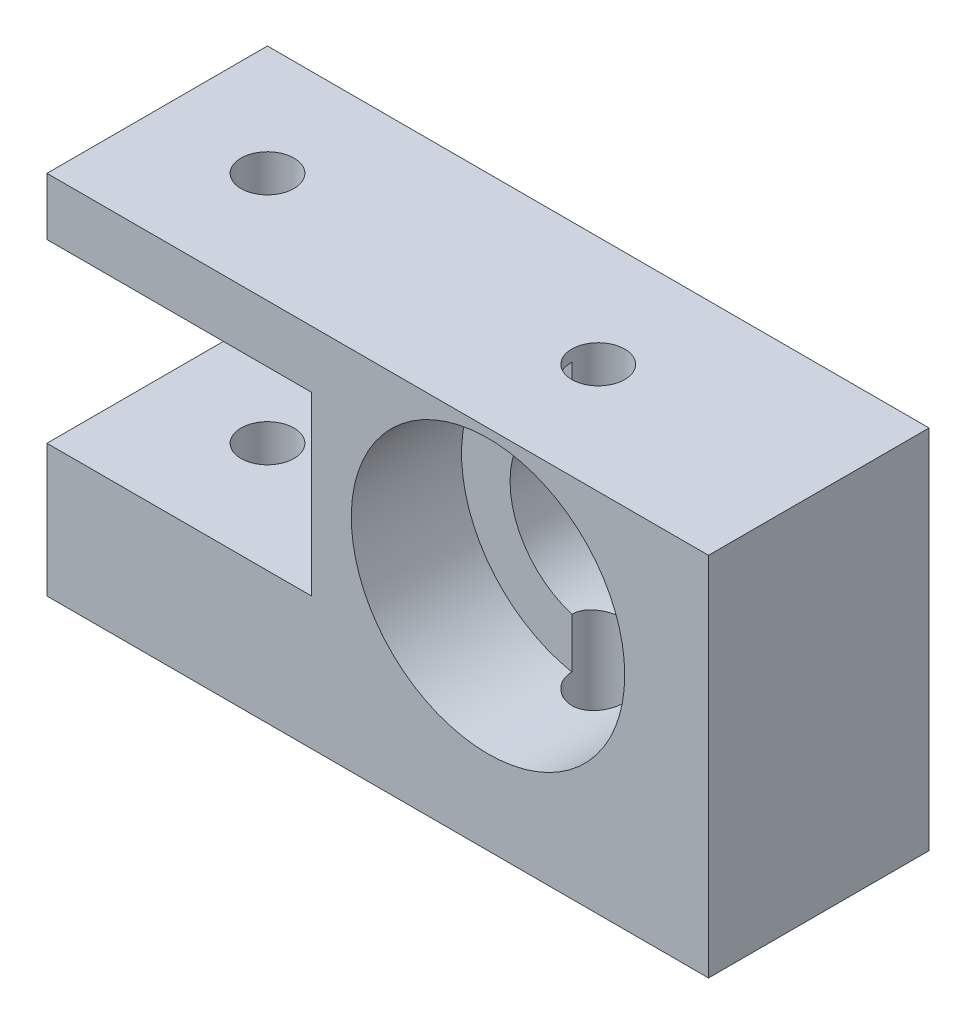
ISO-10303-21;
HEADER;
FILE_DESCRIPTION(('STEP AP214'),'2;1');
FILE_NAME('part.step','',(''),(''),'','','');
FILE_SCHEMA(('AUTOMOTIVE_DESIGN { 1 0 10303 214 1 1 1 1 }'));
ENDSEC;
DATA;
#1=APPLICATION_CONTEXT('core data for automotive mechanical design processes');
#2=APPLICATION_PROTOCOL_DEFINITION('international standard','automotive_design',2000,#1);
#3=PRODUCT_CONTEXT('',#1,'mechanical');
#4=PRODUCT('Part','Part','',(#3));
#5=PRODUCT_RELATED_PRODUCT_CATEGORY('part','',(#4));
#6=PRODUCT_DEFINITION_FORMATION('','',#4);
#7=PRODUCT_DEFINITION_CONTEXT('part definition',#1,'design');
#8=PRODUCT_DEFINITION('design','',#6,#7);
#9=PRODUCT_DEFINITION_SHAPE('','',#8);
#10=(LENGTH_UNIT() NAMED_UNIT(*) SI_UNIT(.MILLI.,.METRE.));
#11=(NAMED_UNIT(*) PLANE_ANGLE_UNIT() SI_UNIT($,.RADIAN.));
#12=(NAMED_UNIT(*) SI_UNIT($,.STERADIAN.) SOLID_ANGLE_UNIT());
#13=UNCERTAINTY_MEASURE_WITH_UNIT(LENGTH_MEASURE(1.E-05),#10,'distance_accuracy_value','');
#14=(GEOMETRIC_REPRESENTATION_CONTEXT(3) GLOBAL_UNCERTAINTY_ASSIGNED_CONTEXT((#13)) GLOBAL_UNIT_ASSIGNED_CONTEXT((#10,
#11,#12)) REPRESENTATION_CONTEXT('',''));
#15=CARTESIAN_POINT('',(0.,0.,0.));
#16=DIRECTION('',(0.,0.,1.));
#17=DIRECTION('',(1.,0.,0.));
#18=AXIS2_PLACEMENT_3D('',#15,#16,#17);
#19=CARTESIAN_POINT('',(0.,5.00000000000006,0.));
#20=DIRECTION('',(0.,-1.,0.));
#21=DIRECTION('',(1.,0.,0.));
#22=AXIS2_PLACEMENT_3D('',#19,#20,#21);
#23=CYLINDRICAL_SURFACE('',#22,0.6);
#24=CARTESIAN_POINT('',(0.,3.3,0.));
#25=DIRECTION('',(0.,-1.,0.));
#26=DIRECTION('',(1.,0.,0.));
#27=AXIS2_PLACEMENT_3D('',#24,#25,#26);
#28=CIRCLE('',#27,0.6);
#29=CARTESIAN_POINT('',(0.600000000000052,3.3,0.));
#30=VERTEX_POINT('',#29);
#31=EDGE_CURVE('E249',#30,#30,#28,.F.);
#32=ORIENTED_EDGE('',*,*,#31,.T.);
#33=EDGE_LOOP('',(#32));
#34=FACE_BOUND('',#33,.T.);
#35=DIRECTION('',(0.,-1.,0.));
#36=VECTOR('',#35,1.);
#37=CARTESIAN_POINT('',(-0.599999999999937,5.00000000000007,0.));
#38=LINE('',#37,#36);
#39=CARTESIAN_POINT('',(-0.599999999999957,1.9078784028339,0.));
#40=VERTEX_POINT('',#39);
#41=CARTESIAN_POINT('',(-0.59999999999995,3.04138126514912,0.));
#42=VERTEX_POINT('',#41);
#43=EDGE_CURVE('E176',#40,#42,#38,.F.);
#44=ORIENTED_EDGE('',*,*,#43,.F.);
#45=CARTESIAN_POINT('',(0.600000000000043,1.90787840283388,0.));
#46=CARTESIAN_POINT('',(0.599999590536835,1.90787874305864,0.0328778191669716));
#47=CARTESIAN_POINT('',(0.597288432676084,1.90873756141657,0.0657596896279538));
#48=CARTESIAN_POINT('',(0.586543377794207,1.91206631379487,0.130562099809387));
#49=CARTESIAN_POINT('',(0.578507702295427,1.91453678613028,0.162482314595133));
#50=CARTESIAN_POINT('',(0.557411013077367,1.92078440978677,0.224413891318323));
#51=CARTESIAN_POINT('',(0.544358357576347,1.92455938677114,0.254428331855816));
#52=CARTESIAN_POINT('',(0.51362568767243,1.93298773023204,0.311848773595534));
#53=CARTESIAN_POINT('',(0.495944980548436,1.93764122817541,0.339254383473071));
#54=CARTESIAN_POINT('',(0.455859016566365,1.94746744873138,0.391546556231669));
#55=CARTESIAN_POINT('',(0.433332828703221,1.9526512332434,0.416338359178706));
#56=CARTESIAN_POINT('',(0.384454495031934,1.96285944775015,0.461855180528808));
#57=CARTESIAN_POINT('',(0.358101858184503,1.96788385719166,0.482579676179897));
#58=CARTESIAN_POINT('',(0.301644575117507,1.97733285831668,0.519785079933374));
#59=CARTESIAN_POINT('',(0.271473608534367,1.98174289736938,0.536169369777136));
#60=CARTESIAN_POINT('',(0.20864985814779,1.98933774368296,0.563594903617086));
#61=CARTESIAN_POINT('',(0.175997611355211,1.99252281515804,0.574637299942974));
#62=CARTESIAN_POINT('',(0.110129541052376,1.9972305840143,0.590752000436205));
#63=CARTESIAN_POINT('',(0.0769565595815649,1.99879822947734,0.59598605106108));
#64=CARTESIAN_POINT('',(0.0101687294997707,2.00025280600541,0.600846929858574));
#65=CARTESIAN_POINT('',(-0.0234460248201029,2.00014009008432,0.600474935760784));
#66=CARTESIAN_POINT('',(-0.08902846264002,1.99827841527064,0.59424285258279));
#67=CARTESIAN_POINT('',(-0.121014507056493,1.99658168082106,0.588557922476051));
#68=CARTESIAN_POINT('',(-0.183555685376967,1.99180608845036,0.572147465602283));
#69=CARTESIAN_POINT('',(-0.214110728529095,1.9887271430023,0.561421619622931));
#70=CARTESIAN_POINT('',(-0.273338930540469,1.98146088394791,0.535115190632575));
#71=CARTESIAN_POINT('',(-0.301986025877748,1.97726107870702,0.51947951887709));
#72=CARTESIAN_POINT('',(-0.356305869513218,1.9681985625921,0.483840859028709));
#73=CARTESIAN_POINT('',(-0.381977909948808,1.96333569455042,0.463836834814612));
#74=CARTESIAN_POINT('',(-0.430664192611877,1.9532462019534,0.419120899699353));
#75=CARTESIAN_POINT('',(-0.453537832160406,1.94801278128862,0.394257232388077));
#76=CARTESIAN_POINT('',(-0.494830606159247,1.93793591954723,0.340995992844005));
#77=CARTESIAN_POINT('',(-0.513249297931353,1.93309251725774,0.312598069844407));
#78=CARTESIAN_POINT('',(-0.545255981341771,1.92431161280117,0.252704212300303));
#79=CARTESIAN_POINT('',(-0.558795956950726,1.92038324282302,0.221181181654453));
#80=CARTESIAN_POINT('',(-0.580333451513558,1.91398557015459,0.15615711662216));
#81=CARTESIAN_POINT('',(-0.588332778562004,1.91151579151712,0.122656731387589));
#82=CARTESIAN_POINT('',(-0.598299081128147,1.90841939830595,0.0559670557073196));
#83=CARTESIAN_POINT('',(-0.600479785520901,1.90772751519821,0.0228127104463217));
#84=CARTESIAN_POINT('',(-0.599343788932265,1.90808477028172,-0.0433891600023366));
#85=CARTESIAN_POINT('',(-0.596027857484727,1.9091336647626,-0.0764366994939145));
#86=CARTESIAN_POINT('',(-0.584183054296474,1.91279023408721,-0.140595351191037));
#87=CARTESIAN_POINT('',(-0.575791845725012,1.91535670599444,-0.171734465706131));
#88=CARTESIAN_POINT('',(-0.554194310991782,1.92171656496045,-0.232160676325247));
#89=CARTESIAN_POINT('',(-0.540987241371012,1.92551014144594,-0.261447485656034));
#90=CARTESIAN_POINT('',(-0.50972748478594,1.9340233400823,-0.318206985629055));
#91=CARTESIAN_POINT('',(-0.491554256690867,1.93876508427655,-0.345609888394372));
#92=CARTESIAN_POINT('',(-0.451021206401499,1.94859282259061,-0.39705524247227));
#93=CARTESIAN_POINT('',(-0.428660382139543,1.95367889892075,-0.421096887045103));
#94=CARTESIAN_POINT('',(-0.379382052997394,1.96385453419189,-0.466072162325912));
#95=CARTESIAN_POINT('',(-0.352324426342929,1.96893698025182,-0.486854251594799));
#96=CARTESIAN_POINT('',(-0.294984713836055,1.97833940699481,-0.523586680411099));
#97=CARTESIAN_POINT('',(-0.264702788217533,1.98265942553893,-0.539537259912585));
#98=CARTESIAN_POINT('',(-0.201974201882044,1.99002388189978,-0.566000012227321));
#99=CARTESIAN_POINT('',(-0.169545848815091,1.99307781369985,-0.576552806463592));
#100=CARTESIAN_POINT('',(-0.103267986601791,1.99760791838732,-0.59202436755617));
#101=CARTESIAN_POINT('',(-0.0694188869418608,1.99908454268352,-0.596944746379368));
#102=CARTESIAN_POINT('',(-0.00266086155305317,2.00026617632559,-0.600889217621801));
#103=CARTESIAN_POINT('',(0.0302340716345264,2.00003722044529,-0.600133078163134));
#104=CARTESIAN_POINT('',(0.095407792465805,1.99798905786014,-0.593271347000353));
#105=CARTESIAN_POINT('',(0.127686614938655,1.99616994132184,-0.587166058607824));
#106=CARTESIAN_POINT('',(0.190374325216587,1.99116467343331,-0.569915335440152));
#107=CARTESIAN_POINT('',(0.2207995709406,1.98799341160347,-0.558824727740397));
#108=CARTESIAN_POINT('',(0.279373295100864,1.98061177215778,-0.531967234197125));
#109=CARTESIAN_POINT('',(0.307521398420274,1.97640122379972,-0.516199579885524));
#110=CARTESIAN_POINT('',(0.361720756968269,1.96721586331296,-0.479850617027989));
#111=CARTESIAN_POINT('',(0.387676100030753,1.96222090769445,-0.459131427999702));
#112=CARTESIAN_POINT('',(0.435815028538419,1.9520941488491,-0.413715844666874));
#113=CARTESIAN_POINT('',(0.457997523840808,1.94696230656348,-0.389018304840712));
#114=CARTESIAN_POINT('',(0.498625077578248,1.93696272252611,-0.335463688675828));
#115=CARTESIAN_POINT('',(0.516939039031906,1.93210741077714,-0.306504578643938));
#116=CARTESIAN_POINT('',(0.548417254115109,1.92341019003195,-0.245777930335482));
#117=CARTESIAN_POINT('',(0.561583982229059,1.91956779437582,-0.214011750559107));
#118=CARTESIAN_POINT('',(0.581207770131964,1.91371126688106,-0.152103827357862));
#119=CARTESIAN_POINT('',(0.588235436045406,1.91154461939998,-0.122156541228919));
#120=CARTESIAN_POINT('',(0.597631275340182,1.90862817035074,-0.0614739110003776));
#121=CARTESIAN_POINT('',(0.600000382822801,1.90787808474478,-0.0307387261370159));
#122=CARTESIAN_POINT('',(0.600000000000043,1.90787840283388,0.));
#123=B_SPLINE_CURVE_WITH_KNOTS('',3,(#45,#46,#47,#48,#49,#50,#51,#52,#53,#54,#55,#56,#57,#58,
#59,#60,#61,#62,#63,#64,#65,#66,#67,#68,#69,#70,#71,#72,#73,#74,#75,#76,#77,#78,#79,#80,#81,#82,
#83,#84,#85,#86,#87,#88,#89,#90,#91,#92,#93,#94,#95,#96,#97,#98,#99,#100,#101,#102,#103,#104,
#105,#106,#107,#108,#109,#110,#111,#112,#113,#114,#115,#116,#117,#118,#119,#120,#121,#122),
.UNSPECIFIED.,.T.,.F.,(4,2,2,2,2,2,2,2,2,2,2,2,2,2,2,2,2,2,2,2,2,2,2,2,2,2,2,2,2,2,2,2,2,2,2,2,
2,2,4),(0.,0.0985200663519467,0.197073056647981,0.295462565758858,0.393866810120421,
0.495092600004316,0.596331391457472,0.699663757066959,0.802973822323889,0.903328560570612,
1.00366221637814,1.1008005039359,1.19794494353389,1.29622083731509,1.3945200663357,
1.49660858806549,1.59870724993983,1.70178495295745,1.80482900248603,1.9040323231203,
2.00322175637538,2.0998343797011,2.19646192412898,2.29568292718339,2.39492770366153,
2.49791802434824,2.60090322924264,2.70310156720313,2.80527064923256,2.90350521559071,
3.00173421213685,3.09890838743471,3.19609853791135,3.29639850816379,3.39672741046539,
3.50004655862242,3.60331597580161,3.69544461537562,3.78755478008007),.UNSPECIFIED.);
#124=CARTESIAN_POINT('',(0.600000000000043,1.90787840283388,0.));
#125=VERTEX_POINT('',#124);
#126=EDGE_CURVE('E11',#40,#125,#123,.T.);
#127=ORIENTED_EDGE('',*,*,#126,.T.);
#128=DIRECTION('',(0.,-1.,0.));
#129=VECTOR('',#128,1.);
#130=CARTESIAN_POINT('',(0.600000000000063,5.00000000000006,0.));
#131=LINE('',#130,#129);
#132=CARTESIAN_POINT('',(0.60000000000005,3.0413812651491,0.));
#133=VERTEX_POINT('',#132);
#134=EDGE_CURVE('E181',#133,#125,#131,.T.);
#135=ORIENTED_EDGE('',*,*,#134,.F.);
#136=CARTESIAN_POINT('',(0.60000000000005,3.0413812651491,0.));
#137=CARTESIAN_POINT('',(0.60003014107028,3.04135962845536,0.0334194408038753));
#138=CARTESIAN_POINT('',(0.597209826353904,3.04193152121581,0.0668230801908513));
#139=CARTESIAN_POINT('',(0.586099444078463,3.04409995212986,0.132624163564484));
#140=CARTESIAN_POINT('',(0.577817657800346,3.04569493885655,0.165023053307644));
#141=CARTESIAN_POINT('',(0.556012771140522,3.04974832281781,0.227950939705535));
#142=CARTESIAN_POINT('',(0.542488972692526,3.05220683504194,0.258479686690512));
#143=CARTESIAN_POINT('',(0.510605322385548,3.05770252810659,0.316839707769189));
#144=CARTESIAN_POINT('',(0.492245059987178,3.06073975806505,0.344670752596115));
#145=CARTESIAN_POINT('',(0.450951200562389,3.06709679592976,0.397205901572623));
#146=CARTESIAN_POINT('',(0.427966357393875,3.07041950705926,0.421869381278697));
#147=CARTESIAN_POINT('',(0.37818469740508,3.07694744770666,0.467017831407349));
#148=CARTESIAN_POINT('',(0.351387292569414,3.08015265900635,0.487502156086075));
#149=CARTESIAN_POINT('',(0.294472427163447,3.08611568209301,0.523865874892667));
#150=CARTESIAN_POINT('',(0.264329763185039,3.08886964768389,0.539706506804978));
#151=CARTESIAN_POINT('',(0.201750341178271,3.09358693017056,0.566082503992346));
#152=CARTESIAN_POINT('',(0.169313910738606,3.09555035970125,0.576618625103251));
#153=CARTESIAN_POINT('',(0.103491169941702,3.09844492336338,0.591960668025206));
#154=CARTESIAN_POINT('',(0.0701215315258731,3.09938850330172,0.596835730930017));
#155=CARTESIAN_POINT('',(0.00302476599431574,3.10017999936263,0.600932869086223));
#156=CARTESIAN_POINT('',(-0.0307023369517901,3.1000279890965,0.600155324129076));
#157=CARTESIAN_POINT('',(-0.0970803456066664,3.09865507806165,0.593021855372236));
#158=CARTESIAN_POINT('',(-0.129739607457678,3.09744847308192,0.586740536335284));
#159=CARTESIAN_POINT('',(-0.193531392516181,3.09411803796599,0.568896024433195));
#160=CARTESIAN_POINT('',(-0.224663868269231,3.09199417934049,0.557332667510712));
#161=CARTESIAN_POINT('',(-0.284733773810673,3.08704410230084,0.529181981558555));
#162=CARTESIAN_POINT('',(-0.313656968187265,3.08421376085188,0.512565030817269));
#163=CARTESIAN_POINT('',(-0.368331208252142,3.07816338826119,0.474801227076458));
#164=CARTESIAN_POINT('',(-0.394082016229092,3.07494332795308,0.453654034944413));
#165=CARTESIAN_POINT('',(-0.442120951624487,3.06840793858233,0.407022957764069));
#166=CARTESIAN_POINT('',(-0.464346155116491,3.06509191138792,0.38147430829603));
#167=CARTESIAN_POINT('',(-0.504212201602446,3.05878714607584,0.326970968017063));
#168=CARTESIAN_POINT('',(-0.52185176851951,3.05579849919414,0.298015332369755));
#169=CARTESIAN_POINT('',(-0.552066007993741,3.05048520003543,0.237428987383769));
#170=CARTESIAN_POINT('',(-0.564628115543932,3.04816219908932,0.205791873270527));
#171=CARTESIAN_POINT('',(-0.584223098571664,3.04446784907679,0.140821595906898));
#172=CARTESIAN_POINT('',(-0.591264214548973,3.04309508207432,0.107491039733943));
#173=CARTESIAN_POINT('',(-0.596959985771136,3.04197963542445,0.0615805025097326));
#174=CARTESIAN_POINT('',(-0.59810040330446,3.04175548339478,0.0492823217500671));
#175=CARTESIAN_POINT('',(-0.599619447428007,3.04145642824819,0.0246579311037416));
#176=CARTESIAN_POINT('',(-0.599999351125864,3.04138127492434,0.0123318030637616));
#177=CARTESIAN_POINT('',(-0.599999999999952,3.04138126514914,0.));
#178=B_SPLINE_CURVE_WITH_KNOTS('',3,(#136,#137,#138,#139,#140,#141,#142,#143,#144,#145,#146,
#147,#148,#149,#150,#151,#152,#153,#154,#155,#156,#157,#158,#159,#160,#161,#162,#163,#164,#165,
#166,#167,#168,#169,#170,#171,#172,#173,#174,#175,#176,#177),.UNSPECIFIED.,.F.,.F.,(4,2,2,2,2,2,
2,2,2,2,2,2,2,2,2,2,2,2,2,2,4),(0.,0.100110729627641,0.200070008374164,0.300042603035742,
0.400023686527437,0.50118061774217,0.602353167443441,0.704347638986313,0.806327573295771,
0.907048425901526,1.00776251126519,1.10713215659886,1.20650488851186,1.3064717039744,
1.40644600553963,1.50804152993869,1.60966529583845,1.71153902896512,1.8132604168134,
1.85030068262917,1.88727869550581),.UNSPECIFIED.);
#179=EDGE_CURVE('E253',#133,#42,#178,.T.);
#180=ORIENTED_EDGE('',*,*,#179,.T.);
#181=EDGE_LOOP('',(#44,#127,#135,#180));
#182=FACE_BOUND('',#181,.T.);
#183=ADVANCED_FACE('F43',(#34,#182),#23,.F.);
#184=CARTESIAN_POINT('',(-10.,0.,2.5));
#185=DIRECTION('',(-1.,0.,0.));
#186=DIRECTION('',(0.,0.,1.));
#187=AXIS2_PLACEMENT_3D('',#184,#185,#186);
#188=PLANE('',#187);
#189=DIRECTION('',(0.,0.,-1.));
#190=VECTOR('',#189,1.);
#191=CARTESIAN_POINT('',(-10.,-2.,2.5));
#192=LINE('',#191,#190);
#193=CARTESIAN_POINT('',(-10.,-2.,2.5));
#194=VERTEX_POINT('',#193);
#195=CARTESIAN_POINT('',(-10.,-2.,-2.5));
#196=VERTEX_POINT('',#195);
#197=EDGE_CURVE('E188',#194,#196,#192,.T.);
#198=ORIENTED_EDGE('',*,*,#197,.T.);
#199=DIRECTION('',(0.,1.,0.));
#200=VECTOR('',#199,1.);
#201=CARTESIAN_POINT('',(-10.,-5.,-2.5));
#202=LINE('',#201,#200);
#203=CARTESIAN_POINT('',(-10.,-5.,-2.5));
#204=VERTEX_POINT('',#203);
#205=EDGE_CURVE('E157',#204,#196,#202,.T.);
#206=ORIENTED_EDGE('',*,*,#205,.F.);
#207=DIRECTION('',(0.,0.,-1.));
#208=VECTOR('',#207,1.);
#209=CARTESIAN_POINT('',(-10.,-5.,2.5));
#210=LINE('',#209,#208);
#211=CARTESIAN_POINT('',(-10.,-5.,2.5));
#212=VERTEX_POINT('',#211);
#213=EDGE_CURVE('E154',#212,#204,#210,.T.);
#214=ORIENTED_EDGE('',*,*,#213,.F.);
#215=DIRECTION('',(0.,1.,0.));
#216=VECTOR('',#215,1.);
#217=CARTESIAN_POINT('',(-10.,0.,2.5));
#218=LINE('',#217,#216);
#219=EDGE_CURVE('E172',#212,#194,#218,.T.);
#220=ORIENTED_EDGE('',*,*,#219,.T.);
#221=EDGE_LOOP('',(#198,#206,#214,#220));
#222=FACE_BOUND('',#221,.T.);
#223=ADVANCED_FACE('F236',(#222),#188,.T.);
#224=CARTESIAN_POINT('',(-7.49999999999992,5.00000000000011,0.));
#225=DIRECTION('',(0.,-1.,0.));
#226=DIRECTION('',(1.,0.,0.));
#227=AXIS2_PLACEMENT_3D('',#224,#225,#226);
#228=CYLINDRICAL_SURFACE('',#227,0.6);
#229=CARTESIAN_POINT('',(-7.49999999999997,-2.,0.));
#230=DIRECTION('',(0.,-1.,0.));
#231=DIRECTION('',(1.,0.,0.));
#232=AXIS2_PLACEMENT_3D('',#229,#230,#231);
#233=CIRCLE('',#232,0.6);
#234=CARTESIAN_POINT('',(-6.89999999999997,-2.,0.));
#235=VERTEX_POINT('',#234);
#236=EDGE_CURVE('E187',#235,#235,#233,.F.);
#237=ORIENTED_EDGE('',*,*,#236,.T.);
#238=EDGE_LOOP('',(#237));
#239=FACE_BOUND('',#238,.T.);
#240=CARTESIAN_POINT('',(-7.49999999999999,-4.99999999999995,0.));
#241=DIRECTION('',(0.,-1.,0.));
#242=DIRECTION('',(1.,0.,0.));
#243=AXIS2_PLACEMENT_3D('',#240,#241,#242);
#244=CIRCLE('',#243,0.6);
#245=CARTESIAN_POINT('',(-6.89999999999999,-4.99999999999996,0.));
#246=VERTEX_POINT('',#245);
#247=EDGE_CURVE('E292',#246,#246,#244,.T.);
#248=ORIENTED_EDGE('',*,*,#247,.T.);
#249=EDGE_LOOP('',(#248));
#250=FACE_BOUND('',#249,.T.);
#251=ADVANCED_FACE('F227',(#239,#250),#228,.F.);
#252=CARTESIAN_POINT('',(0.,0.,0.));
#253=DIRECTION('',(0.,0.,-1.));
#254=DIRECTION('',(-1.,0.,0.));
#255=AXIS2_PLACEMENT_3D('',#252,#253,#254);
#256=PLANE('',#255);
#257=ORIENTED_EDGE('',*,*,#134,.T.);
#258=CARTESIAN_POINT('',(0.,0.,0.));
#259=DIRECTION('',(0.,0.,-1.));
#260=DIRECTION('',(-1.,0.,0.));
#261=AXIS2_PLACEMENT_3D('',#258,#259,#260);
#262=CIRCLE('',#261,2.);
#263=CARTESIAN_POINT('',(0.600000000000018,-1.90787840283389,0.));
#264=VERTEX_POINT('',#263);
#265=EDGE_CURVE('E258',#125,#264,#262,.T.);
#266=ORIENTED_EDGE('',*,*,#265,.T.);
#267=CARTESIAN_POINT('',(0.600000000000011,-3.04138126514911,0.));
#268=VERTEX_POINT('',#267);
#269=EDGE_CURVE('E180',#264,#268,#131,.T.);
#270=ORIENTED_EDGE('',*,*,#269,.T.);
#271=CARTESIAN_POINT('',(0.,0.,0.));
#272=DIRECTION('',(0.,0.,1.));
#273=DIRECTION('',(1.,0.,0.));
#274=AXIS2_PLACEMENT_3D('',#271,#272,#273);
#275=CIRCLE('',#274,3.1);
#276=EDGE_CURVE('E156',#268,#133,#275,.T.);
#277=ORIENTED_EDGE('',*,*,#276,.T.);
#278=EDGE_LOOP('',(#257,#266,#270,#277));
#279=FACE_BOUND('',#278,.T.);
#280=ADVANCED_FACE('F235',(#279),#256,.F.);
#281=CARTESIAN_POINT('',(0.,-5.,2.5));
#282=DIRECTION('',(0.,1.,0.));
#283=DIRECTION('',(0.,0.,1.));
#284=AXIS2_PLACEMENT_3D('',#281,#282,#283);
#285=PLANE('',#284);
#286=ORIENTED_EDGE('',*,*,#247,.F.);
#287=EDGE_LOOP('',(#286));
#288=FACE_BOUND('',#287,.T.);
#289=CARTESIAN_POINT('',(0.,-5.,0.));
#290=DIRECTION('',(0.,-1.,0.));
#291=DIRECTION('',(1.,0.,0.));
#292=AXIS2_PLACEMENT_3D('',#289,#290,#291);
#293=CIRCLE('',#292,0.6);
#294=CARTESIAN_POINT('',(0.599999999999998,-5.,0.));
#295=VERTEX_POINT('',#294);
#296=EDGE_CURVE('E191',#295,#295,#293,.T.);
#297=ORIENTED_EDGE('',*,*,#296,.F.);
#298=EDGE_LOOP('',(#297));
#299=FACE_BOUND('',#298,.T.);
#300=DIRECTION('',(-1.,0.,0.));
#301=VECTOR('',#300,1.);
#302=CARTESIAN_POINT('',(-10.,-5.,-2.5));
#303=LINE('',#302,#301);
#304=CARTESIAN_POINT('',(5.,-5.,-2.5));
#305=VERTEX_POINT('',#304);
#306=EDGE_CURVE('E148',#305,#204,#303,.T.);
#307=ORIENTED_EDGE('',*,*,#306,.F.);
#308=DIRECTION('',(0.,0.,1.));
#309=VECTOR('',#308,1.);
#310=CARTESIAN_POINT('',(5.,-5.,-2.5));
#311=LINE('',#310,#309);
#312=CARTESIAN_POINT('',(5.,-5.,2.5));
#313=VERTEX_POINT('',#312);
#314=EDGE_CURVE('E132',#305,#313,#311,.T.);
#315=ORIENTED_EDGE('',*,*,#314,.T.);
#316=DIRECTION('',(1.,0.,0.));
#317=VECTOR('',#316,1.);
#318=CARTESIAN_POINT('',(0.,-5.,2.5));
#319=LINE('',#318,#317);
#320=EDGE_CURVE('E169',#212,#313,#319,.T.);
#321=ORIENTED_EDGE('',*,*,#320,.F.);
#322=ORIENTED_EDGE('',*,*,#213,.T.);
#323=EDGE_LOOP('',(#307,#315,#321,#322));
#324=FACE_BOUND('',#323,.T.);
#325=ADVANCED_FACE('F153',(#288,#299,#324),#285,.F.);
#326=CARTESIAN_POINT('',(0.,0.,2.5));
#327=DIRECTION('',(0.,0.,-1.));
#328=DIRECTION('',(-1.,0.,0.));
#329=AXIS2_PLACEMENT_3D('',#326,#327,#328);
#330=CYLINDRICAL_SURFACE('',#329,3.1);
#331=CARTESIAN_POINT('',(-0.599999999999989,-3.04138126514911,0.));
#332=CARTESIAN_POINT('',(-0.600030141070219,-3.04135962845537,0.0334194408038754));
#333=CARTESIAN_POINT('',(-0.597209826353842,-3.04193152121583,0.0668230801908514));
#334=CARTESIAN_POINT('',(-0.586099444078401,-3.04409995212987,0.132624163564484));
#335=CARTESIAN_POINT('',(-0.577817657800284,-3.04569493885656,0.165023053307644));
#336=CARTESIAN_POINT('',(-0.55601277114046,-3.04974832281783,0.227950939705536));
#337=CARTESIAN_POINT('',(-0.542488972692464,-3.05220683504195,0.258479686690512));
#338=CARTESIAN_POINT('',(-0.510605322385487,-3.0577025281066,0.316839707769189));
#339=CARTESIAN_POINT('',(-0.492245059987116,-3.06073975806507,0.344670752596116));
#340=CARTESIAN_POINT('',(-0.450951200562327,-3.06709679592977,0.397205901572623));
#341=CARTESIAN_POINT('',(-0.427966357393813,-3.07041950705927,0.421869381278698));
#342=CARTESIAN_POINT('',(-0.378184697405018,-3.07694744770667,0.467017831407349));
#343=CARTESIAN_POINT('',(-0.351387292569352,-3.08015265900636,0.487502156086076));
#344=CARTESIAN_POINT('',(-0.294472427163384,-3.08611568209302,0.523865874892668));
#345=CARTESIAN_POINT('',(-0.264329763184977,-3.0888696476839,0.539706506804979));
#346=CARTESIAN_POINT('',(-0.201750341178209,-3.09358693017057,0.566082503992347));
#347=CARTESIAN_POINT('',(-0.169313910738544,-3.09555035970126,0.576618625103251));
#348=CARTESIAN_POINT('',(-0.103491169941639,-3.09844492336338,0.591960668025206));
#349=CARTESIAN_POINT('',(-0.0701215315258106,-3.09938850330173,0.596835730930017));
#350=CARTESIAN_POINT('',(-0.00302476599425337,-3.10017999936264,0.600932869086223));
#351=CARTESIAN_POINT('',(0.0307023369518524,-3.1000279890965,0.600155324129076));
#352=CARTESIAN_POINT('',(0.0970803456067285,-3.09865507806165,0.593021855372236));
#353=CARTESIAN_POINT('',(0.12973960745774,-3.09744847308192,0.586740536335284));
#354=CARTESIAN_POINT('',(0.193531392516243,-3.09411803796599,0.568896024433195));
#355=CARTESIAN_POINT('',(0.224663868269292,-3.09199417934048,0.557332667510712));
#356=CARTESIAN_POINT('',(0.284733773810735,-3.08704410230084,0.529181981558555));
#357=CARTESIAN_POINT('',(0.313656968187326,-3.08421376085187,0.512565030817269));
#358=CARTESIAN_POINT('',(0.368331208252204,-3.07816338826118,0.474801227076457));
#359=CARTESIAN_POINT('',(0.394082016229154,-3.07494332795308,0.453654034944413));
#360=CARTESIAN_POINT('',(0.442120951624549,-3.06840793858233,0.407022957764069));
#361=CARTESIAN_POINT('',(0.464346155116552,-3.06509191138791,0.381474308296029));
#362=CARTESIAN_POINT('',(0.504212201602508,-3.05878714607583,0.326970968017063));
#363=CARTESIAN_POINT('',(0.521851768519572,-3.05579849919414,0.298015332369754));
#364=CARTESIAN_POINT('',(0.552066007993803,-3.05048520003542,0.237428987383767));
#365=CARTESIAN_POINT('',(0.564628115543994,-3.04816219908931,0.205791873270525));
#366=CARTESIAN_POINT('',(0.584223098571726,-3.04446784907679,0.140821595906897));
#367=CARTESIAN_POINT('',(0.591264214549035,-3.04309508207431,0.107491039733942));
#368=CARTESIAN_POINT('',(0.596959985771198,-3.04197963542444,0.0615805025097313));
#369=CARTESIAN_POINT('',(0.598100403304521,-3.04175548339477,0.0492823217500661));
#370=CARTESIAN_POINT('',(0.599619447428068,-3.04145642824818,0.0246579311037411));
#371=CARTESIAN_POINT('',(0.599999351125926,-3.04138127492433,0.0123318030637614));
#372=CARTESIAN_POINT('',(0.600000000000013,-3.04138126514913,0.));
#373=B_SPLINE_CURVE_WITH_KNOTS('',3,(#331,#332,#333,#334,#335,#336,#337,#338,#339,#340,#341,
#342,#343,#344,#345,#346,#347,#348,#349,#350,#351,#352,#353,#354,#355,#356,#357,#358,#359,#360,
#361,#362,#363,#364,#365,#366,#367,#368,#369,#370,#371,#372),.UNSPECIFIED.,.F.,.F.,(4,2,2,2,2,2,
2,2,2,2,2,2,2,2,2,2,2,2,2,2,4),(0.,0.100110729627641,0.200070008374164,0.300042603035742,
0.400023686527438,0.50118061774217,0.602353167443442,0.704347638986314,0.806327573295772,
0.907048425901526,1.00776251126519,1.10713215659886,1.20650488851186,1.3064717039744,
1.40644600553963,1.5080415299387,1.60966529583845,1.71153902896513,1.81326041681341,
1.85030068262917,1.88727869550581),.UNSPECIFIED.);
#374=CARTESIAN_POINT('',(-0.599999999999989,-3.04138126514911,0.));
#375=VERTEX_POINT('',#374);
#376=EDGE_CURVE('E301',#375,#268,#373,.T.);
#377=ORIENTED_EDGE('',*,*,#376,.F.);
#378=EDGE_CURVE('E160',#42,#375,#275,.T.);
#379=ORIENTED_EDGE('',*,*,#378,.F.);
#380=ORIENTED_EDGE('',*,*,#179,.F.);
#381=ORIENTED_EDGE('',*,*,#276,.F.);
#382=EDGE_LOOP('',(#377,#379,#380,#381));
#383=FACE_BOUND('',#382,.T.);
#384=CARTESIAN_POINT('',(0.,0.,2.5));
#385=DIRECTION('',(0.,0.,1.));
#386=DIRECTION('',(1.,0.,0.));
#387=AXIS2_PLACEMENT_3D('',#384,#385,#386);
#388=CIRCLE('',#387,3.1);
#389=CARTESIAN_POINT('',(3.1,0.,2.5));
#390=VERTEX_POINT('',#389);
#391=EDGE_CURVE('E166',#390,#390,#388,.T.);
#392=ORIENTED_EDGE('',*,*,#391,.T.);
#393=EDGE_LOOP('',(#392));
#394=FACE_BOUND('',#393,.T.);
#395=ADVANCED_FACE('F45',(#383,#394),#330,.F.);
#396=DIRECTION('',(0.,0.,1.));
#397=VECTOR('',#396,1.);
#398=CARTESIAN_POINT('',(-10.,3.3,-2.5));
#399=LINE('',#398,#397);
#400=CARTESIAN_POINT('',(-10.,3.3,-2.5));
#401=VERTEX_POINT('',#400);
#402=CARTESIAN_POINT('',(-10.,3.3,2.5));
#403=VERTEX_POINT('',#402);
#404=EDGE_CURVE('E319',#401,#403,#399,.T.);
#405=ORIENTED_EDGE('',*,*,#404,.F.);
#406=CARTESIAN_POINT('',(-10.,2.,-2.5));
#407=VERTEX_POINT('',#406);
#408=EDGE_CURVE('E162',#407,#401,#202,.T.);
#409=ORIENTED_EDGE('',*,*,#408,.F.);
#410=DIRECTION('',(0.,0.,-1.));
#411=VECTOR('',#410,1.);
#412=CARTESIAN_POINT('',(-10.,2.,2.5));
#413=LINE('',#412,#411);
#414=CARTESIAN_POINT('',(-10.,2.,2.5));
#415=VERTEX_POINT('',#414);
#416=EDGE_CURVE('E278',#415,#407,#413,.T.);
#417=ORIENTED_EDGE('',*,*,#416,.F.);
#418=EDGE_CURVE('E171',#415,#403,#218,.T.);
#419=ORIENTED_EDGE('',*,*,#418,.T.);
#420=EDGE_LOOP('',(#405,#409,#417,#419));
#421=FACE_BOUND('',#420,.T.);
#422=ADVANCED_FACE('F245',(#421),#188,.T.);
#423=CARTESIAN_POINT('',(0.,0.,2.5));
#424=DIRECTION('',(0.,0.,1.));
#425=DIRECTION('',(1.,0.,0.));
#426=AXIS2_PLACEMENT_3D('',#423,#424,#425);
#427=PLANE('',#426);
#428=DIRECTION('',(0.,-1.,0.));
#429=VECTOR('',#428,1.);
#430=CARTESIAN_POINT('',(5.,3.3,2.5));
#431=LINE('',#430,#429);
#432=CARTESIAN_POINT('',(5.,3.3,2.5));
#433=VERTEX_POINT('',#432);
#434=EDGE_CURVE('E135',#433,#313,#431,.T.);
#435=ORIENTED_EDGE('',*,*,#434,.F.);
#436=DIRECTION('',(1.,0.,0.));
#437=VECTOR('',#436,1.);
#438=CARTESIAN_POINT('',(10.,3.3,2.5));
#439=LINE('',#438,#437);
#440=EDGE_CURVE('E140',#403,#433,#439,.T.);
#441=ORIENTED_EDGE('',*,*,#440,.F.);
#442=ORIENTED_EDGE('',*,*,#418,.F.);
#443=DIRECTION('',(1.,0.,0.));
#444=VECTOR('',#443,1.);
#445=CARTESIAN_POINT('',(-10.,2.,2.5));
#446=LINE('',#445,#444);
#447=CARTESIAN_POINT('',(-4.00000000000002,2.,2.5));
#448=VERTEX_POINT('',#447);
#449=EDGE_CURVE('E268',#415,#448,#446,.T.);
#450=ORIENTED_EDGE('',*,*,#449,.T.);
#451=DIRECTION('',(0.,-1.,0.));
#452=VECTOR('',#451,1.);
#453=CARTESIAN_POINT('',(-4.00000000000002,-2.,2.5));
#454=LINE('',#453,#452);
#455=CARTESIAN_POINT('',(-4.00000000000002,-2.,2.5));
#456=VERTEX_POINT('',#455);
#457=EDGE_CURVE('E271',#448,#456,#454,.T.);
#458=ORIENTED_EDGE('',*,*,#457,.T.);
#459=DIRECTION('',(-1.,0.,0.));
#460=VECTOR('',#459,1.);
#461=CARTESIAN_POINT('',(-10.,-2.,2.5));
#462=LINE('',#461,#460);
#463=EDGE_CURVE('E275',#456,#194,#462,.T.);
#464=ORIENTED_EDGE('',*,*,#463,.T.);
#465=ORIENTED_EDGE('',*,*,#219,.F.);
#466=ORIENTED_EDGE('',*,*,#320,.T.);
#467=EDGE_LOOP('',(#435,#441,#442,#450,#458,#464,#465,#466));
#468=FACE_BOUND('',#467,.T.);
#469=ORIENTED_EDGE('',*,*,#391,.F.);
#470=EDGE_LOOP('',(#469));
#471=FACE_BOUND('',#470,.T.);
#472=ADVANCED_FACE('F329',(#468,#471),#427,.T.);
#473=CARTESIAN_POINT('',(-0.599999999999982,-1.9078784028339,0.));
#474=VERTEX_POINT('',#473);
#475=EDGE_CURVE('E177',#375,#474,#38,.F.);
#476=ORIENTED_EDGE('',*,*,#475,.T.);
#477=CARTESIAN_POINT('',(0.,0.,0.));
#478=DIRECTION('',(0.,0.,-1.));
#479=DIRECTION('',(-1.,0.,0.));
#480=AXIS2_PLACEMENT_3D('',#477,#478,#479);
#481=CIRCLE('',#480,2.);
#482=EDGE_CURVE('E68',#474,#40,#481,.T.);
#483=ORIENTED_EDGE('',*,*,#482,.T.);
#484=ORIENTED_EDGE('',*,*,#43,.T.);
#485=ORIENTED_EDGE('',*,*,#378,.T.);
#486=EDGE_LOOP('',(#476,#483,#484,#485));
#487=FACE_BOUND('',#486,.T.);
#488=ADVANCED_FACE('F257',(#487),#256,.F.);
#489=CARTESIAN_POINT('',(0.,0.,-2.5));
#490=DIRECTION('',(0.,0.,-1.));
#491=DIRECTION('',(-1.,0.,0.));
#492=AXIS2_PLACEMENT_3D('',#489,#490,#491);
#493=PLANE('',#492);
#494=DIRECTION('',(0.,-1.,0.));
#495=VECTOR('',#494,1.);
#496=CARTESIAN_POINT('',(5.,3.3,-2.5));
#497=LINE('',#496,#495);
#498=CARTESIAN_POINT('',(5.,3.3,-2.5));
#499=VERTEX_POINT('',#498);
#500=EDGE_CURVE('E60',#499,#305,#497,.T.);
#501=ORIENTED_EDGE('',*,*,#500,.T.);
#502=ORIENTED_EDGE('',*,*,#306,.T.);
#503=ORIENTED_EDGE('',*,*,#205,.T.);
#504=DIRECTION('',(-1.,0.,0.));
#505=VECTOR('',#504,1.);
#506=CARTESIAN_POINT('',(-10.,-2.,-2.5));
#507=LINE('',#506,#505);
#508=CARTESIAN_POINT('',(-4.00000000000002,-2.,-2.5));
#509=VERTEX_POINT('',#508);
#510=EDGE_CURVE('E272',#509,#196,#507,.T.);
#511=ORIENTED_EDGE('',*,*,#510,.F.);
#512=DIRECTION('',(0.,-1.,0.));
#513=VECTOR('',#512,1.);
#514=CARTESIAN_POINT('',(-4.00000000000002,-2.,-2.5));
#515=LINE('',#514,#513);
#516=CARTESIAN_POINT('',(-4.00000000000002,2.,-2.5));
#517=VERTEX_POINT('',#516);
#518=EDGE_CURVE('E281',#517,#509,#515,.T.);
#519=ORIENTED_EDGE('',*,*,#518,.F.);
#520=DIRECTION('',(1.,0.,0.));
#521=VECTOR('',#520,1.);
#522=CARTESIAN_POINT('',(-10.,2.,-2.5));
#523=LINE('',#522,#521);
#524=EDGE_CURVE('E262',#407,#517,#523,.T.);
#525=ORIENTED_EDGE('',*,*,#524,.F.);
#526=ORIENTED_EDGE('',*,*,#408,.T.);
#527=DIRECTION('',(1.,0.,0.));
#528=VECTOR('',#527,1.);
#529=CARTESIAN_POINT('',(10.,3.3,-2.5));
#530=LINE('',#529,#528);
#531=EDGE_CURVE('E151',#401,#499,#530,.T.);
#532=ORIENTED_EDGE('',*,*,#531,.T.);
#533=EDGE_LOOP('',(#501,#502,#503,#511,#519,#525,#526,#532));
#534=FACE_BOUND('',#533,.T.);
#535=CARTESIAN_POINT('',(0.,0.,-2.5));
#536=DIRECTION('',(0.,0.,1.));
#537=DIRECTION('',(1.,0.,0.));
#538=AXIS2_PLACEMENT_3D('',#535,#536,#537);
#539=CIRCLE('',#538,2.);
#540=CARTESIAN_POINT('',(2.,0.,-2.5));
#541=VERTEX_POINT('',#540);
#542=EDGE_CURVE('E259',#541,#541,#539,.T.);
#543=ORIENTED_EDGE('',*,*,#542,.T.);
#544=EDGE_LOOP('',(#543));
#545=FACE_BOUND('',#544,.T.);
#546=ADVANCED_FACE('F145',(#534,#545),#493,.T.);
#547=ORIENTED_EDGE('',*,*,#296,.T.);
#548=EDGE_LOOP('',(#547));
#549=FACE_BOUND('',#548,.T.);
#550=ORIENTED_EDGE('',*,*,#269,.F.);
#551=CARTESIAN_POINT('',(0.600000000000018,-1.90787840283389,0.));
#552=CARTESIAN_POINT('',(0.59999959053681,-1.90787874305865,-0.0328778191669741));
#553=CARTESIAN_POINT('',(0.597288432676059,-1.90873756141657,-0.0657596896279564));
#554=CARTESIAN_POINT('',(0.586543377794182,-1.91206631379488,-0.13056209980939));
#555=CARTESIAN_POINT('',(0.578507702295402,-1.91453678613029,-0.162482314595136));
#556=CARTESIAN_POINT('',(0.557411013077342,-1.92078440978678,-0.224413891318325));
#557=CARTESIAN_POINT('',(0.544358357576322,-1.92455938677115,-0.254428331855818));
#558=CARTESIAN_POINT('',(0.513625687672405,-1.93298773023204,-0.311848773595536));
#559=CARTESIAN_POINT('',(0.495944980548411,-1.93764122817542,-0.339254383473074));
#560=CARTESIAN_POINT('',(0.45585901656634,-1.94746744873139,-0.391546556231672));
#561=CARTESIAN_POINT('',(0.433332828703196,-1.95265123324341,-0.416338359178708));
#562=CARTESIAN_POINT('',(0.384454495031909,-1.96285944775015,-0.46185518052881));
#563=CARTESIAN_POINT('',(0.358101858184478,-1.96788385719166,-0.482579676179899));
#564=CARTESIAN_POINT('',(0.301644575117482,-1.97733285831669,-0.519785079933376));
#565=CARTESIAN_POINT('',(0.271473608534342,-1.98174289736938,-0.536169369777138));
#566=CARTESIAN_POINT('',(0.208649858147765,-1.98933774368297,-0.563594903617089));
#567=CARTESIAN_POINT('',(0.175997611355185,-1.99252281515804,-0.574637299942977));
#568=CARTESIAN_POINT('',(0.11012954105235,-1.9972305840143,-0.590752000436208));
#569=CARTESIAN_POINT('',(0.0769565595815389,-1.99879822947734,-0.595986051061083));
#570=CARTESIAN_POINT('',(0.0101687294997448,-2.00025280600541,-0.600846929858576));
#571=CARTESIAN_POINT('',(-0.0234460248201288,-2.00014009008432,-0.600474935760786));
#572=CARTESIAN_POINT('',(-0.0890284626400459,-1.99827841527063,-0.594242852582792));
#573=CARTESIAN_POINT('',(-0.121014507056518,-1.99658168082105,-0.588557922476054));
#574=CARTESIAN_POINT('',(-0.183555685376993,-1.99180608845036,-0.572147465602286));
#575=CARTESIAN_POINT('',(-0.21411072852912,-1.9887271430023,-0.561421619622933));
#576=CARTESIAN_POINT('',(-0.273338930540494,-1.98146088394791,-0.535115190632578));
#577=CARTESIAN_POINT('',(-0.301986025877773,-1.97726107870701,-0.519479518877093));
#578=CARTESIAN_POINT('',(-0.356305869513244,-1.96819856259209,-0.483840859028712));
#579=CARTESIAN_POINT('',(-0.381977909948833,-1.96333569455041,-0.463836834814614));
#580=CARTESIAN_POINT('',(-0.430664192611902,-1.9532462019534,-0.419120899699356));
#581=CARTESIAN_POINT('',(-0.453537832160431,-1.94801278128862,-0.39425723238808));
#582=CARTESIAN_POINT('',(-0.494830606159272,-1.93793591954722,-0.340995992844008));
#583=CARTESIAN_POINT('',(-0.513249297931378,-1.93309251725773,-0.31259806984441));
#584=CARTESIAN_POINT('',(-0.545255981341796,-1.92431161280117,-0.252704212300306));
#585=CARTESIAN_POINT('',(-0.558795956950751,-1.92038324282302,-0.221181181654456));
#586=CARTESIAN_POINT('',(-0.580333451513583,-1.91398557015458,-0.156157116622163));
#587=CARTESIAN_POINT('',(-0.588332778562029,-1.91151579151711,-0.122656731387592));
#588=CARTESIAN_POINT('',(-0.598299081128172,-1.90841939830594,-0.0559670557073223));
#589=CARTESIAN_POINT('',(-0.600479785520926,-1.90772751519821,-0.0228127104463242));
#590=CARTESIAN_POINT('',(-0.59934378893229,-1.90808477028172,0.043389160002334));
#591=CARTESIAN_POINT('',(-0.596027857484752,-1.90913366476259,0.0764366994939119));
#592=CARTESIAN_POINT('',(-0.584183054296499,-1.9127902340872,0.140595351191034));
#593=CARTESIAN_POINT('',(-0.575791845725037,-1.91535670599444,0.171734465706128));
#594=CARTESIAN_POINT('',(-0.554194310991807,-1.92171656496044,0.232160676325245));
#595=CARTESIAN_POINT('',(-0.540987241371037,-1.92551014144594,0.261447485656031));
#596=CARTESIAN_POINT('',(-0.509727484785965,-1.9340233400823,0.318206985629052));
#597=CARTESIAN_POINT('',(-0.491554256690892,-1.93876508427654,0.345609888394369));
#598=CARTESIAN_POINT('',(-0.451021206401525,-1.94859282259061,0.397055242472267));
#599=CARTESIAN_POINT('',(-0.428660382139569,-1.95367889892074,0.421096887045101));
#600=CARTESIAN_POINT('',(-0.379382052997419,-1.96385453419188,0.466072162325909));
#601=CARTESIAN_POINT('',(-0.352324426342954,-1.96893698025182,0.486854251594796));
#602=CARTESIAN_POINT('',(-0.294984713836081,-1.97833940699481,0.523586680411096));
#603=CARTESIAN_POINT('',(-0.264702788217559,-1.98265942553892,0.539537259912583));
#604=CARTESIAN_POINT('',(-0.20197420188207,-1.99002388189978,0.566000012227318));
#605=CARTESIAN_POINT('',(-0.169545848815117,-1.99307781369985,0.576552806463589));
#606=CARTESIAN_POINT('',(-0.103267986601817,-1.99760791838732,0.592024367556167));
#607=CARTESIAN_POINT('',(-0.0694188869418868,-1.99908454268352,0.596944746379365));
#608=CARTESIAN_POINT('',(-0.00266086155307911,-2.00026617632559,0.600889217621798));
#609=CARTESIAN_POINT('',(0.0302340716345005,-2.00003722044529,0.600133078163132));
#610=CARTESIAN_POINT('',(0.0954077924657792,-1.99798905786014,0.59327134700035));
#611=CARTESIAN_POINT('',(0.127686614938629,-1.99616994132184,0.587166058607822));
#612=CARTESIAN_POINT('',(0.190374325216561,-1.99116467343331,0.569915335440149));
#613=CARTESIAN_POINT('',(0.220799570940574,-1.98799341160348,0.558824727740394));
#614=CARTESIAN_POINT('',(0.279373295100838,-1.98061177215778,0.531967234197122));
#615=CARTESIAN_POINT('',(0.307521398420249,-1.97640122379973,0.516199579885521));
#616=CARTESIAN_POINT('',(0.361720756968244,-1.96721586331297,0.479850617027987));
#617=CARTESIAN_POINT('',(0.387676100030727,-1.96222090769445,0.4591314279997));
#618=CARTESIAN_POINT('',(0.435815028538393,-1.95209414884911,0.413715844666872));
#619=CARTESIAN_POINT('',(0.457997523840783,-1.94696230656349,0.38901830484071));
#620=CARTESIAN_POINT('',(0.498625077578223,-1.93696272252612,0.335463688675825));
#621=CARTESIAN_POINT('',(0.516939039031881,-1.93210741077715,0.306504578643935));
#622=CARTESIAN_POINT('',(0.548417254115084,-1.92341019003196,0.245777930335479));
#623=CARTESIAN_POINT('',(0.561583982229034,-1.91956779437583,0.214011750559104));
#624=CARTESIAN_POINT('',(0.581207770131939,-1.91371126688107,0.152103827357859));
#625=CARTESIAN_POINT('',(0.588235436045381,-1.91154461939999,0.122156541228916));
#626=CARTESIAN_POINT('',(0.597631275340158,-1.90862817035075,0.0614739110003751));
#627=CARTESIAN_POINT('',(0.600000382822776,-1.90787808474479,0.0307387261370133));
#628=CARTESIAN_POINT('',(0.600000000000018,-1.90787840283389,0.));
#629=B_SPLINE_CURVE_WITH_KNOTS('',3,(#551,#552,#553,#554,#555,#556,#557,#558,#559,#560,#561,
#562,#563,#564,#565,#566,#567,#568,#569,#570,#571,#572,#573,#574,#575,#576,#577,#578,#579,#580,
#581,#582,#583,#584,#585,#586,#587,#588,#589,#590,#591,#592,#593,#594,#595,#596,#597,#598,#599,
#600,#601,#602,#603,#604,#605,#606,#607,#608,#609,#610,#611,#612,#613,#614,#615,#616,#617,#618,
#619,#620,#621,#622,#623,#624,#625,#626,#627,#628),.UNSPECIFIED.,.T.,.F.,(4,2,2,2,2,2,2,2,2,2,2,
2,2,2,2,2,2,2,2,2,2,2,2,2,2,2,2,2,2,2,2,2,2,2,2,2,2,2,4),(0.,0.0985200663519467,
0.197073056647981,0.295462565758858,0.393866810120421,0.495092600004316,0.596331391457471,
0.699663757066959,0.802973822323889,0.903328560570612,1.00366221637814,1.1008005039359,
1.19794494353389,1.29622083731509,1.3945200663357,1.49660858806549,1.59870724993983,
1.70178495295745,1.80482900248603,1.9040323231203,2.00322175637538,2.0998343797011,
2.19646192412898,2.29568292718339,2.39492770366153,2.49791802434824,2.60090322924264,
2.70310156720313,2.80527064923256,2.90350521559071,3.00173421213685,3.09890838743471,
3.19609853791135,3.29639850816379,3.3967274104654,3.50004655862242,3.60331597580161,
3.69544461537562,3.78755478008007),.UNSPECIFIED.);
#630=EDGE_CURVE('E53',#264,#474,#629,.T.);
#631=ORIENTED_EDGE('',*,*,#630,.T.);
#632=ORIENTED_EDGE('',*,*,#475,.F.);
#633=ORIENTED_EDGE('',*,*,#376,.T.);
#634=EDGE_LOOP('',(#550,#631,#632,#633));
#635=FACE_BOUND('',#634,.T.);
#636=ADVANCED_FACE('F200',(#549,#635),#23,.F.);
#637=CARTESIAN_POINT('',(-7.49999999999993,3.3,0.));
#638=DIRECTION('',(0.,-1.,0.));
#639=DIRECTION('',(1.,0.,0.));
#640=AXIS2_PLACEMENT_3D('',#637,#638,#639);
#641=CIRCLE('',#640,0.6);
#642=CARTESIAN_POINT('',(-6.89999999999993,3.3,0.));
#643=VERTEX_POINT('',#642);
#644=EDGE_CURVE('E48',#643,#643,#641,.F.);
#645=ORIENTED_EDGE('',*,*,#644,.T.);
#646=EDGE_LOOP('',(#645));
#647=FACE_BOUND('',#646,.T.);
#648=CARTESIAN_POINT('',(-7.49999999999994,2.,0.));
#649=DIRECTION('',(0.,1.,0.));
#650=DIRECTION('',(-1.,0.,0.));
#651=AXIS2_PLACEMENT_3D('',#648,#649,#650);
#652=CIRCLE('',#651,0.6);
#653=CARTESIAN_POINT('',(-8.09999999999994,2.,0.));
#654=VERTEX_POINT('',#653);
#655=EDGE_CURVE('E184',#654,#654,#652,.F.);
#656=ORIENTED_EDGE('',*,*,#655,.T.);
#657=EDGE_LOOP('',(#656));
#658=FACE_BOUND('',#657,.T.);
#659=ADVANCED_FACE('F218',(#647,#658),#228,.F.);
#660=CARTESIAN_POINT('',(-10.,-2.,2.5));
#661=DIRECTION('',(0.,-1.,0.));
#662=DIRECTION('',(1.,0.,0.));
#663=AXIS2_PLACEMENT_3D('',#660,#661,#662);
#664=PLANE('',#663);
#665=ORIENTED_EDGE('',*,*,#510,.T.);
#666=ORIENTED_EDGE('',*,*,#197,.F.);
#667=ORIENTED_EDGE('',*,*,#463,.F.);
#668=DIRECTION('',(0.,0.,-1.));
#669=VECTOR('',#668,1.);
#670=CARTESIAN_POINT('',(-4.00000000000002,-2.,2.5));
#671=LINE('',#670,#669);
#672=EDGE_CURVE('E287',#456,#509,#671,.T.);
#673=ORIENTED_EDGE('',*,*,#672,.T.);
#674=EDGE_LOOP('',(#665,#666,#667,#673));
#675=FACE_BOUND('',#674,.T.);
#676=ORIENTED_EDGE('',*,*,#236,.F.);
#677=EDGE_LOOP('',(#676));
#678=FACE_BOUND('',#677,.T.);
#679=ADVANCED_FACE('F213',(#675,#678),#664,.F.);
#680=CARTESIAN_POINT('',(-10.,2.,2.5));
#681=DIRECTION('',(0.,1.,0.));
#682=DIRECTION('',(-1.,0.,0.));
#683=AXIS2_PLACEMENT_3D('',#680,#681,#682);
#684=PLANE('',#683);
#685=ORIENTED_EDGE('',*,*,#524,.T.);
#686=DIRECTION('',(0.,0.,-1.));
#687=VECTOR('',#686,1.);
#688=CARTESIAN_POINT('',(-4.00000000000002,2.,2.5));
#689=LINE('',#688,#687);
#690=EDGE_CURVE('E289',#448,#517,#689,.T.);
#691=ORIENTED_EDGE('',*,*,#690,.F.);
#692=ORIENTED_EDGE('',*,*,#449,.F.);
#693=ORIENTED_EDGE('',*,*,#416,.T.);
#694=EDGE_LOOP('',(#685,#691,#692,#693));
#695=FACE_BOUND('',#694,.T.);
#696=ORIENTED_EDGE('',*,*,#655,.F.);
#697=EDGE_LOOP('',(#696));
#698=FACE_BOUND('',#697,.T.);
#699=ADVANCED_FACE('F217',(#695,#698),#684,.F.);
#700=CARTESIAN_POINT('',(-4.00000000000002,-2.,2.5));
#701=DIRECTION('',(1.,0.,0.));
#702=DIRECTION('',(0.,1.,0.));
#703=AXIS2_PLACEMENT_3D('',#700,#701,#702);
#704=PLANE('',#703);
#705=ORIENTED_EDGE('',*,*,#518,.T.);
#706=ORIENTED_EDGE('',*,*,#672,.F.);
#707=ORIENTED_EDGE('',*,*,#457,.F.);
#708=ORIENTED_EDGE('',*,*,#690,.T.);
#709=EDGE_LOOP('',(#705,#706,#707,#708));
#710=FACE_BOUND('',#709,.T.);
#711=ADVANCED_FACE('F210',(#710),#704,.F.);
#712=CARTESIAN_POINT('',(0.,0.,-2.5));
#713=DIRECTION('',(0.,0.,1.));
#714=DIRECTION('',(1.,0.,0.));
#715=AXIS2_PLACEMENT_3D('',#712,#713,#714);
#716=CYLINDRICAL_SURFACE('',#715,2.);
#717=ORIENTED_EDGE('',*,*,#542,.F.);
#718=EDGE_LOOP('',(#717));
#719=FACE_BOUND('',#718,.T.);
#720=ORIENTED_EDGE('',*,*,#482,.F.);
#721=ORIENTED_EDGE('',*,*,#630,.F.);
#722=ORIENTED_EDGE('',*,*,#265,.F.);
#723=ORIENTED_EDGE('',*,*,#126,.F.);
#724=EDGE_LOOP('',(#720,#721,#722,#723));
#725=FACE_BOUND('',#724,.T.);
#726=ADVANCED_FACE('F204',(#719,#725),#716,.F.);
#727=CARTESIAN_POINT('',(10.,3.3,-2.5));
#728=DIRECTION('',(0.,-1.,0.));
#729=DIRECTION('',(1.,0.,0.));
#730=AXIS2_PLACEMENT_3D('',#727,#728,#729);
#731=PLANE('',#730);
#732=ORIENTED_EDGE('',*,*,#644,.F.);
#733=EDGE_LOOP('',(#732));
#734=FACE_BOUND('',#733,.T.);
#735=ORIENTED_EDGE('',*,*,#440,.T.);
#736=DIRECTION('',(0.,0.,1.));
#737=VECTOR('',#736,1.);
#738=CARTESIAN_POINT('',(5.,3.3,-2.5));
#739=LINE('',#738,#737);
#740=EDGE_CURVE('E141',#499,#433,#739,.T.);
#741=ORIENTED_EDGE('',*,*,#740,.F.);
#742=ORIENTED_EDGE('',*,*,#531,.F.);
#743=ORIENTED_EDGE('',*,*,#404,.T.);
#744=EDGE_LOOP('',(#735,#741,#742,#743));
#745=FACE_BOUND('',#744,.T.);
#746=ORIENTED_EDGE('',*,*,#31,.F.);
#747=EDGE_LOOP('',(#746));
#748=FACE_BOUND('',#747,.T.);
#749=ADVANCED_FACE('F209',(#734,#745,#748),#731,.F.);
#750=CARTESIAN_POINT('',(5.,3.3,-2.5));
#751=DIRECTION('',(-1.,0.,0.));
#752=DIRECTION('',(0.,-1.,0.));
#753=AXIS2_PLACEMENT_3D('',#750,#751,#752);
#754=PLANE('',#753);
#755=ORIENTED_EDGE('',*,*,#434,.T.);
#756=ORIENTED_EDGE('',*,*,#314,.F.);
#757=ORIENTED_EDGE('',*,*,#500,.F.);
#758=ORIENTED_EDGE('',*,*,#740,.T.);
#759=EDGE_LOOP('',(#755,#756,#757,#758));
#760=FACE_BOUND('',#759,.T.);
#761=ADVANCED_FACE('F133',(#760),#754,.F.);
#762=CLOSED_SHELL('',(#183,#223,#251,#280,#325,#395,#422,#472,#488,#546,#636,#659,#679,#699,
#711,#726,#749,#761));
#763=MANIFOLD_SOLID_BREP('B2',#762);
#764=ADVANCED_BREP_SHAPE_REPRESENTATION('',(#18,#763),#14);
#765=SHAPE_DEFINITION_REPRESENTATION(#9,#764);
ENDSEC;
END-ISO-10303-21;
